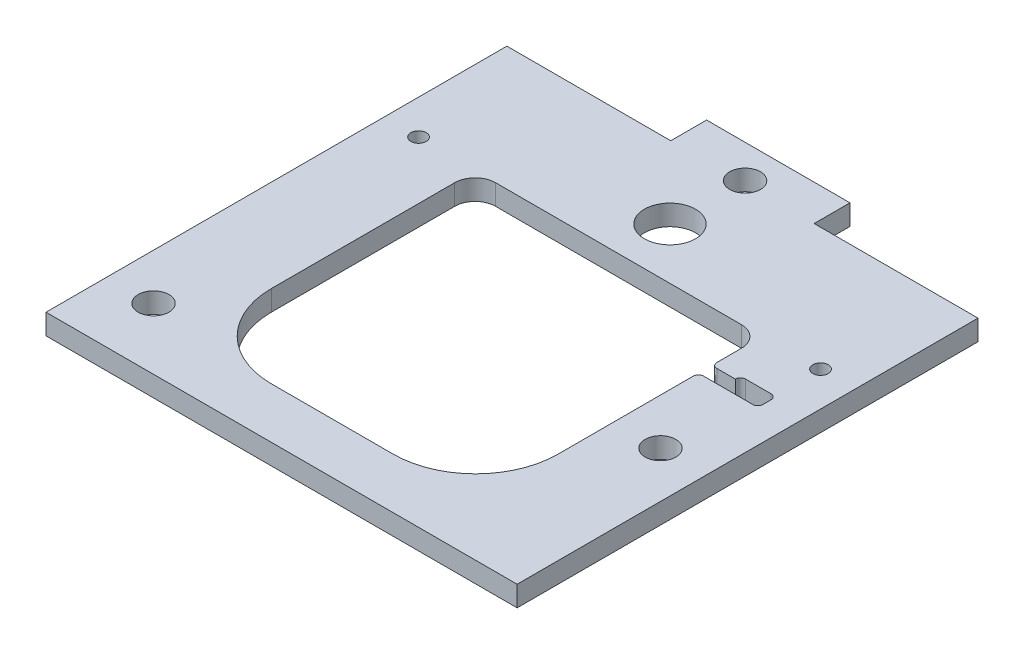
ISO-10303-21;
HEADER;
FILE_DESCRIPTION(('STEP AP214'),'2;1');
FILE_NAME('part.step','',(''),(''),'','','');
FILE_SCHEMA(('AUTOMOTIVE_DESIGN { 1 0 10303 214 1 1 1 1 }'));
ENDSEC;
DATA;
#1=APPLICATION_CONTEXT('core data for automotive mechanical design processes');
#2=APPLICATION_PROTOCOL_DEFINITION('international standard','automotive_design',2000,#1);
#3=PRODUCT_CONTEXT('',#1,'mechanical');
#4=PRODUCT('Part','Part','',(#3));
#5=PRODUCT_RELATED_PRODUCT_CATEGORY('part','',(#4));
#6=PRODUCT_DEFINITION_FORMATION('','',#4);
#7=PRODUCT_DEFINITION_CONTEXT('part definition',#1,'design');
#8=PRODUCT_DEFINITION('design','',#6,#7);
#9=PRODUCT_DEFINITION_SHAPE('','',#8);
#10=(LENGTH_UNIT() NAMED_UNIT(*) SI_UNIT(.MILLI.,.METRE.));
#11=(NAMED_UNIT(*) PLANE_ANGLE_UNIT() SI_UNIT($,.RADIAN.));
#12=(NAMED_UNIT(*) SI_UNIT($,.STERADIAN.) SOLID_ANGLE_UNIT());
#13=UNCERTAINTY_MEASURE_WITH_UNIT(LENGTH_MEASURE(1.E-05),#10,'distance_accuracy_value','');
#14=(GEOMETRIC_REPRESENTATION_CONTEXT(3) GLOBAL_UNCERTAINTY_ASSIGNED_CONTEXT((#13)) GLOBAL_UNIT_ASSIGNED_CONTEXT((#10,
#11,#12)) REPRESENTATION_CONTEXT('',''));
#15=CARTESIAN_POINT('',(0.,0.,0.));
#16=DIRECTION('',(0.,0.,1.));
#17=DIRECTION('',(1.,0.,0.));
#18=AXIS2_PLACEMENT_3D('',#15,#16,#17);
#19=CARTESIAN_POINT('',(14.,0.,-32.9));
#20=DIRECTION('',(1.,0.,0.));
#21=DIRECTION('',(0.,0.,-1.));
#22=AXIS2_PLACEMENT_3D('',#19,#20,#21);
#23=PLANE('',#22);
#24=DIRECTION('',(0.,0.,-1.));
#25=VECTOR('',#24,1.);
#26=CARTESIAN_POINT('',(14.,0.,-32.9));
#27=LINE('',#26,#25);
#28=CARTESIAN_POINT('',(14.,0.,-28.5));
#29=VERTEX_POINT('',#28);
#30=CARTESIAN_POINT('',(14.,0.,-30.9));
#31=VERTEX_POINT('',#30);
#32=EDGE_CURVE('E298',#29,#31,#27,.T.);
#33=ORIENTED_EDGE('',*,*,#32,.F.);
#34=DIRECTION('',(0.,1.,0.));
#35=VECTOR('',#34,1.);
#36=CARTESIAN_POINT('',(14.,0.,-28.5));
#37=LINE('',#36,#35);
#38=CARTESIAN_POINT('',(14.,2.,-28.5));
#39=VERTEX_POINT('',#38);
#40=EDGE_CURVE('E458',#29,#39,#37,.T.);
#41=ORIENTED_EDGE('',*,*,#40,.T.);
#42=DIRECTION('',(0.,0.,-1.));
#43=VECTOR('',#42,1.);
#44=CARTESIAN_POINT('',(14.,2.,-32.9));
#45=LINE('',#44,#43);
#46=CARTESIAN_POINT('',(14.,2.,-30.9));
#47=VERTEX_POINT('',#46);
#48=EDGE_CURVE('E320',#39,#47,#45,.T.);
#49=ORIENTED_EDGE('',*,*,#48,.T.);
#50=DIRECTION('',(0.,1.,0.));
#51=VECTOR('',#50,1.);
#52=CARTESIAN_POINT('',(14.,0.,-30.9));
#53=LINE('',#52,#51);
#54=EDGE_CURVE('E431',#47,#31,#53,.F.);
#55=ORIENTED_EDGE('',*,*,#54,.T.);
#56=EDGE_LOOP('',(#33,#41,#49,#55));
#57=FACE_BOUND('',#56,.T.);
#58=ADVANCED_FACE('F40',(#57),#23,.F.);
#59=CARTESIAN_POINT('',(23.,2.,-45.));
#60=DIRECTION('',(0.,-1.,0.));
#61=DIRECTION('',(0.,0.,-1.));
#62=AXIS2_PLACEMENT_3D('',#59,#60,#61);
#63=PLANE('',#62);
#64=CARTESIAN_POINT('',(19.625,2.,-33.));
#65=DIRECTION('',(0.,1.,0.));
#66=DIRECTION('',(0.,0.,1.));
#67=AXIS2_PLACEMENT_3D('',#64,#65,#66);
#68=CIRCLE('',#67,0.750000000000009);
#69=CARTESIAN_POINT('',(19.625,2.,-32.25));
#70=VERTEX_POINT('',#69);
#71=EDGE_CURVE('E256',#70,#70,#68,.T.);
#72=ORIENTED_EDGE('',*,*,#71,.F.);
#73=EDGE_LOOP('',(#72));
#74=FACE_BOUND('',#73,.T.);
#75=CARTESIAN_POINT('',(-19.625,2.,-33.));
#76=DIRECTION('',(0.,1.,0.));
#77=DIRECTION('',(0.,0.,1.));
#78=AXIS2_PLACEMENT_3D('',#75,#76,#77);
#79=CIRCLE('',#78,0.750000000000002);
#80=CARTESIAN_POINT('',(-19.625,2.,-32.25));
#81=VERTEX_POINT('',#80);
#82=EDGE_CURVE('E262',#81,#81,#79,.T.);
#83=ORIENTED_EDGE('',*,*,#82,.F.);
#84=EDGE_LOOP('',(#83));
#85=FACE_BOUND('',#84,.T.);
#86=CARTESIAN_POINT('',(0.,2.,-37.925));
#87=DIRECTION('',(0.,1.,0.));
#88=DIRECTION('',(0.,0.,1.));
#89=AXIS2_PLACEMENT_3D('',#86,#87,#88);
#90=CIRCLE('',#89,2.5);
#91=CARTESIAN_POINT('',(0.,2.,-35.425));
#92=VERTEX_POINT('',#91);
#93=EDGE_CURVE('E268',#92,#92,#90,.T.);
#94=ORIENTED_EDGE('',*,*,#93,.F.);
#95=EDGE_LOOP('',(#94));
#96=FACE_BOUND('',#95,.T.);
#97=CARTESIAN_POINT('',(0.,2.,-45.2578584115709));
#98=DIRECTION('',(0.,1.,0.));
#99=DIRECTION('',(0.,0.,1.));
#100=AXIS2_PLACEMENT_3D('',#97,#98,#99);
#101=CIRCLE('',#100,1.5);
#102=CARTESIAN_POINT('',(0.,2.,-43.7578584115709));
#103=VERTEX_POINT('',#102);
#104=EDGE_CURVE('E274',#103,#103,#101,.T.);
#105=ORIENTED_EDGE('',*,*,#104,.F.);
#106=EDGE_LOOP('',(#105));
#107=FACE_BOUND('',#106,.T.);
#108=ORIENTED_EDGE('',*,*,#48,.F.);
#109=CARTESIAN_POINT('',(14.5,2.,-28.5));
#110=DIRECTION('',(0.,-1.,0.));
#111=DIRECTION('',(0.,0.,-1.));
#112=AXIS2_PLACEMENT_3D('',#109,#110,#111);
#113=CIRCLE('',#112,0.5);
#114=CARTESIAN_POINT('',(14.5,2.,-28.));
#115=VERTEX_POINT('',#114);
#116=EDGE_CURVE('E463',#39,#115,#113,.F.);
#117=ORIENTED_EDGE('',*,*,#116,.T.);
#118=DIRECTION('',(-1.,0.,0.));
#119=VECTOR('',#118,1.);
#120=CARTESIAN_POINT('',(16.3,2.,-28.));
#121=LINE('',#120,#119);
#122=CARTESIAN_POINT('',(16.3,2.,-28.));
#123=VERTEX_POINT('',#122);
#124=EDGE_CURVE('E247',#123,#115,#121,.T.);
#125=ORIENTED_EDGE('',*,*,#124,.F.);
#126=CARTESIAN_POINT('',(16.8,2.,-28.));
#127=DIRECTION('',(0.,-1.,0.));
#128=DIRECTION('',(0.,0.,-1.));
#129=AXIS2_PLACEMENT_3D('',#126,#127,#128);
#130=CIRCLE('',#129,0.5);
#131=CARTESIAN_POINT('',(16.8,2.,-28.5));
#132=VERTEX_POINT('',#131);
#133=EDGE_CURVE('E237',#123,#132,#130,.T.);
#134=ORIENTED_EDGE('',*,*,#133,.T.);
#135=DIRECTION('',(-1.,0.,0.));
#136=VECTOR('',#135,1.);
#137=CARTESIAN_POINT('',(19.8,2.,-28.5));
#138=LINE('',#137,#136);
#139=CARTESIAN_POINT('',(19.3,2.,-28.5));
#140=VERTEX_POINT('',#139);
#141=EDGE_CURVE('E252',#140,#132,#138,.T.);
#142=ORIENTED_EDGE('',*,*,#141,.F.);
#143=CARTESIAN_POINT('',(19.3,2.,-28.));
#144=DIRECTION('',(0.,-1.,0.));
#145=DIRECTION('',(0.,0.,-1.));
#146=AXIS2_PLACEMENT_3D('',#143,#144,#145);
#147=CIRCLE('',#146,0.5);
#148=CARTESIAN_POINT('',(19.8,2.,-28.));
#149=VERTEX_POINT('',#148);
#150=EDGE_CURVE('E236',#140,#149,#147,.T.);
#151=ORIENTED_EDGE('',*,*,#150,.T.);
#152=DIRECTION('',(0.,0.,-1.));
#153=VECTOR('',#152,1.);
#154=CARTESIAN_POINT('',(19.8,2.,-26.7));
#155=LINE('',#154,#153);
#156=CARTESIAN_POINT('',(19.8,2.,-27.2));
#157=VERTEX_POINT('',#156);
#158=EDGE_CURVE('E482',#157,#149,#155,.T.);
#159=ORIENTED_EDGE('',*,*,#158,.F.);
#160=CARTESIAN_POINT('',(19.3,2.,-27.2));
#161=DIRECTION('',(0.,-1.,0.));
#162=DIRECTION('',(0.,0.,-1.));
#163=AXIS2_PLACEMENT_3D('',#160,#161,#162);
#164=CIRCLE('',#163,0.5);
#165=CARTESIAN_POINT('',(19.3,2.,-26.7));
#166=VERTEX_POINT('',#165);
#167=EDGE_CURVE('E48',#157,#166,#164,.T.);
#168=ORIENTED_EDGE('',*,*,#167,.T.);
#169=DIRECTION('',(1.,0.,0.));
#170=VECTOR('',#169,1.);
#171=CARTESIAN_POINT('',(14.,2.,-26.7));
#172=LINE('',#171,#170);
#173=CARTESIAN_POINT('',(14.5,2.,-26.7));
#174=VERTEX_POINT('',#173);
#175=EDGE_CURVE('E243',#174,#166,#172,.T.);
#176=ORIENTED_EDGE('',*,*,#175,.F.);
#177=CARTESIAN_POINT('',(14.5,2.,-26.2));
#178=DIRECTION('',(0.,-1.,0.));
#179=DIRECTION('',(0.,0.,-1.));
#180=AXIS2_PLACEMENT_3D('',#177,#178,#179);
#181=CIRCLE('',#180,0.5);
#182=CARTESIAN_POINT('',(14.,2.,-26.2));
#183=VERTEX_POINT('',#182);
#184=EDGE_CURVE('E461',#174,#183,#181,.F.);
#185=ORIENTED_EDGE('',*,*,#184,.T.);
#186=CARTESIAN_POINT('',(14.,2.,-13.));
#187=VERTEX_POINT('',#186);
#188=EDGE_CURVE('E321',#187,#183,#45,.T.);
#189=ORIENTED_EDGE('',*,*,#188,.F.);
#190=CARTESIAN_POINT('',(5.95,2.,-13.));
#191=DIRECTION('',(0.,1.,0.));
#192=DIRECTION('',(0.,0.,-1.));
#193=AXIS2_PLACEMENT_3D('',#190,#191,#192);
#194=CIRCLE('',#193,8.05);
#195=CARTESIAN_POINT('',(5.95,2.,-4.95));
#196=VERTEX_POINT('',#195);
#197=EDGE_CURVE('E316',#196,#187,#194,.T.);
#198=ORIENTED_EDGE('',*,*,#197,.F.);
#199=DIRECTION('',(1.,0.,0.));
#200=VECTOR('',#199,1.);
#201=CARTESIAN_POINT('',(-5.95,2.,-4.95));
#202=LINE('',#201,#200);
#203=CARTESIAN_POINT('',(-5.95,2.,-4.95));
#204=VERTEX_POINT('',#203);
#205=EDGE_CURVE('E312',#204,#196,#202,.T.);
#206=ORIENTED_EDGE('',*,*,#205,.F.);
#207=CARTESIAN_POINT('',(-5.95,2.,-13.));
#208=DIRECTION('',(0.,1.,0.));
#209=DIRECTION('',(0.,0.,1.));
#210=AXIS2_PLACEMENT_3D('',#207,#208,#209);
#211=CIRCLE('',#210,8.05);
#212=CARTESIAN_POINT('',(-14.,2.,-13.));
#213=VERTEX_POINT('',#212);
#214=EDGE_CURVE('E308',#213,#204,#211,.T.);
#215=ORIENTED_EDGE('',*,*,#214,.F.);
#216=DIRECTION('',(0.,0.,1.));
#217=VECTOR('',#216,1.);
#218=CARTESIAN_POINT('',(-14.,2.,-32.9));
#219=LINE('',#218,#217);
#220=CARTESIAN_POINT('',(-14.,2.,-30.9));
#221=VERTEX_POINT('',#220);
#222=EDGE_CURVE('E278',#221,#213,#219,.T.);
#223=ORIENTED_EDGE('',*,*,#222,.F.);
#224=CARTESIAN_POINT('',(-12.,2.,-30.9));
#225=DIRECTION('',(0.,-1.,0.));
#226=DIRECTION('',(0.,0.,-1.));
#227=AXIS2_PLACEMENT_3D('',#224,#225,#226);
#228=CIRCLE('',#227,2.);
#229=CARTESIAN_POINT('',(-12.,2.,-32.9));
#230=VERTEX_POINT('',#229);
#231=EDGE_CURVE('E434',#221,#230,#228,.T.);
#232=ORIENTED_EDGE('',*,*,#231,.T.);
#233=DIRECTION('',(-1.,0.,0.));
#234=VECTOR('',#233,1.);
#235=CARTESIAN_POINT('',(-14.,2.,-32.9));
#236=LINE('',#235,#234);
#237=CARTESIAN_POINT('',(12.,2.,-32.9));
#238=VERTEX_POINT('',#237);
#239=EDGE_CURVE('E286',#238,#230,#236,.T.);
#240=ORIENTED_EDGE('',*,*,#239,.F.);
#241=CARTESIAN_POINT('',(12.,2.,-30.9));
#242=DIRECTION('',(0.,-1.,0.));
#243=DIRECTION('',(0.,0.,-1.));
#244=AXIS2_PLACEMENT_3D('',#241,#242,#243);
#245=CIRCLE('',#244,2.);
#246=EDGE_CURVE('E438',#238,#47,#245,.T.);
#247=ORIENTED_EDGE('',*,*,#246,.T.);
#248=EDGE_LOOP('',(#108,#117,#125,#134,#142,#151,#159,#168,#176,#185,#189,#198,#206,#215,#223,
#232,#240,#247));
#249=FACE_BOUND('',#248,.T.);
#250=DIRECTION('',(0.,0.,-1.));
#251=VECTOR('',#250,1.);
#252=CARTESIAN_POINT('',(23.,2.,0.));
#253=LINE('',#252,#251);
#254=CARTESIAN_POINT('',(23.,2.,0.));
#255=VERTEX_POINT('',#254);
#256=CARTESIAN_POINT('',(23.,2.,-45.));
#257=VERTEX_POINT('',#256);
#258=EDGE_CURVE('E354',#255,#257,#253,.T.);
#259=ORIENTED_EDGE('',*,*,#258,.T.);
#260=DIRECTION('',(-1.,0.,0.));
#261=VECTOR('',#260,1.);
#262=CARTESIAN_POINT('',(7.,2.,-45.));
#263=LINE('',#262,#261);
#264=CARTESIAN_POINT('',(7.,2.,-45.));
#265=VERTEX_POINT('',#264);
#266=EDGE_CURVE('E358',#257,#265,#263,.T.);
#267=ORIENTED_EDGE('',*,*,#266,.T.);
#268=DIRECTION('',(0.,0.,-1.));
#269=VECTOR('',#268,1.);
#270=CARTESIAN_POINT('',(7.,2.,-45.));
#271=LINE('',#270,#269);
#272=CARTESIAN_POINT('',(7.,2.,-48.5));
#273=VERTEX_POINT('',#272);
#274=EDGE_CURVE('E361',#265,#273,#271,.T.);
#275=ORIENTED_EDGE('',*,*,#274,.T.);
#276=DIRECTION('',(-1.,0.,0.));
#277=VECTOR('',#276,1.);
#278=CARTESIAN_POINT('',(7.,2.,-48.5));
#279=LINE('',#278,#277);
#280=CARTESIAN_POINT('',(-7.,2.,-48.5));
#281=VERTEX_POINT('',#280);
#282=EDGE_CURVE('E363',#273,#281,#279,.T.);
#283=ORIENTED_EDGE('',*,*,#282,.T.);
#284=DIRECTION('',(0.,0.,1.));
#285=VECTOR('',#284,1.);
#286=CARTESIAN_POINT('',(-7.,2.,-48.5));
#287=LINE('',#286,#285);
#288=CARTESIAN_POINT('',(-7.,2.,-45.));
#289=VERTEX_POINT('',#288);
#290=EDGE_CURVE('E366',#281,#289,#287,.T.);
#291=ORIENTED_EDGE('',*,*,#290,.T.);
#292=DIRECTION('',(-1.,0.,0.));
#293=VECTOR('',#292,1.);
#294=CARTESIAN_POINT('',(-23.,2.,-45.));
#295=LINE('',#294,#293);
#296=CARTESIAN_POINT('',(-23.,2.,-45.));
#297=VERTEX_POINT('',#296);
#298=EDGE_CURVE('E369',#289,#297,#295,.T.);
#299=ORIENTED_EDGE('',*,*,#298,.T.);
#300=DIRECTION('',(0.,0.,1.));
#301=VECTOR('',#300,1.);
#302=CARTESIAN_POINT('',(-23.,2.,0.));
#303=LINE('',#302,#301);
#304=CARTESIAN_POINT('',(-23.,2.,0.));
#305=VERTEX_POINT('',#304);
#306=EDGE_CURVE('E372',#297,#305,#303,.T.);
#307=ORIENTED_EDGE('',*,*,#306,.T.);
#308=DIRECTION('',(1.,0.,0.));
#309=VECTOR('',#308,1.);
#310=CARTESIAN_POINT('',(-23.,2.,0.));
#311=LINE('',#310,#309);
#312=EDGE_CURVE('E375',#305,#255,#311,.T.);
#313=ORIENTED_EDGE('',*,*,#312,.T.);
#314=EDGE_LOOP('',(#259,#267,#275,#283,#291,#299,#307,#313));
#315=FACE_BOUND('',#314,.T.);
#316=CARTESIAN_POINT('',(-18.5,2.,-6.));
#317=DIRECTION('',(0.,1.,0.));
#318=DIRECTION('',(0.,0.,1.));
#319=AXIS2_PLACEMENT_3D('',#316,#317,#318);
#320=CIRCLE('',#319,1.5);
#321=CARTESIAN_POINT('',(-18.5,2.,-4.5));
#322=VERTEX_POINT('',#321);
#323=EDGE_CURVE('E346',#322,#322,#320,.T.);
#324=ORIENTED_EDGE('',*,*,#323,.F.);
#325=EDGE_LOOP('',(#324));
#326=FACE_BOUND('',#325,.T.);
#327=CARTESIAN_POINT('',(18.5,2.,-18.5));
#328=DIRECTION('',(0.,1.,0.));
#329=DIRECTION('',(0.,0.,1.));
#330=AXIS2_PLACEMENT_3D('',#327,#328,#329);
#331=CIRCLE('',#330,1.5);
#332=CARTESIAN_POINT('',(18.5,2.,-17.));
#333=VERTEX_POINT('',#332);
#334=EDGE_CURVE('E338',#333,#333,#331,.T.);
#335=ORIENTED_EDGE('',*,*,#334,.F.);
#336=EDGE_LOOP('',(#335));
#337=FACE_BOUND('',#336,.T.);
#338=ADVANCED_FACE('F479',(#74,#85,#96,#107,#249,#315,#326,#337),#63,.F.);
#339=CARTESIAN_POINT('',(23.,0.,-45.));
#340=DIRECTION('',(0.,-1.,0.));
#341=DIRECTION('',(0.,0.,-1.));
#342=AXIS2_PLACEMENT_3D('',#339,#340,#341);
#343=PLANE('',#342);
#344=DIRECTION('',(-1.,0.,0.));
#345=VECTOR('',#344,1.);
#346=CARTESIAN_POINT('',(16.3,0.,-28.));
#347=LINE('',#346,#345);
#348=CARTESIAN_POINT('',(16.3,0.,-28.));
#349=VERTEX_POINT('',#348);
#350=CARTESIAN_POINT('',(14.5,0.,-28.));
#351=VERTEX_POINT('',#350);
#352=EDGE_CURVE('E229',#349,#351,#347,.T.);
#353=ORIENTED_EDGE('',*,*,#352,.T.);
#354=CARTESIAN_POINT('',(14.5,0.,-28.5));
#355=DIRECTION('',(0.,-1.,0.));
#356=DIRECTION('',(0.,0.,-1.));
#357=AXIS2_PLACEMENT_3D('',#354,#355,#356);
#358=CIRCLE('',#357,0.5);
#359=EDGE_CURVE('E468',#351,#29,#358,.T.);
#360=ORIENTED_EDGE('',*,*,#359,.T.);
#361=ORIENTED_EDGE('',*,*,#32,.T.);
#362=CARTESIAN_POINT('',(12.,0.,-30.9));
#363=DIRECTION('',(0.,-1.,0.));
#364=DIRECTION('',(0.,0.,-1.));
#365=AXIS2_PLACEMENT_3D('',#362,#363,#364);
#366=CIRCLE('',#365,2.);
#367=CARTESIAN_POINT('',(12.,0.,-32.9));
#368=VERTEX_POINT('',#367);
#369=EDGE_CURVE('E441',#31,#368,#366,.F.);
#370=ORIENTED_EDGE('',*,*,#369,.T.);
#371=DIRECTION('',(-1.,0.,0.));
#372=VECTOR('',#371,1.);
#373=CARTESIAN_POINT('',(-14.,0.,-32.9));
#374=LINE('',#373,#372);
#375=CARTESIAN_POINT('',(-12.,0.,-32.9));
#376=VERTEX_POINT('',#375);
#377=EDGE_CURVE('E302',#368,#376,#374,.T.);
#378=ORIENTED_EDGE('',*,*,#377,.T.);
#379=CARTESIAN_POINT('',(-12.,0.,-30.9));
#380=DIRECTION('',(0.,-1.,0.));
#381=DIRECTION('',(0.,0.,-1.));
#382=AXIS2_PLACEMENT_3D('',#379,#380,#381);
#383=CIRCLE('',#382,2.);
#384=CARTESIAN_POINT('',(-14.,0.,-30.9));
#385=VERTEX_POINT('',#384);
#386=EDGE_CURVE('E436',#376,#385,#383,.F.);
#387=ORIENTED_EDGE('',*,*,#386,.T.);
#388=DIRECTION('',(0.,0.,1.));
#389=VECTOR('',#388,1.);
#390=CARTESIAN_POINT('',(-14.,0.,-32.9));
#391=LINE('',#390,#389);
#392=CARTESIAN_POINT('',(-14.,0.,-13.));
#393=VERTEX_POINT('',#392);
#394=EDGE_CURVE('E282',#385,#393,#391,.T.);
#395=ORIENTED_EDGE('',*,*,#394,.T.);
#396=CARTESIAN_POINT('',(-5.95,0.,-13.));
#397=DIRECTION('',(0.,1.,0.));
#398=DIRECTION('',(0.,0.,1.));
#399=AXIS2_PLACEMENT_3D('',#396,#397,#398);
#400=CIRCLE('',#399,8.05);
#401=CARTESIAN_POINT('',(-5.95,0.,-4.95));
#402=VERTEX_POINT('',#401);
#403=EDGE_CURVE('E285',#393,#402,#400,.T.);
#404=ORIENTED_EDGE('',*,*,#403,.T.);
#405=DIRECTION('',(1.,0.,0.));
#406=VECTOR('',#405,1.);
#407=CARTESIAN_POINT('',(-5.95,0.,-4.95));
#408=LINE('',#407,#406);
#409=CARTESIAN_POINT('',(5.95,0.,-4.95));
#410=VERTEX_POINT('',#409);
#411=EDGE_CURVE('E290',#402,#410,#408,.T.);
#412=ORIENTED_EDGE('',*,*,#411,.T.);
#413=CARTESIAN_POINT('',(5.95,0.,-13.));
#414=DIRECTION('',(0.,1.,0.));
#415=DIRECTION('',(0.,0.,-1.));
#416=AXIS2_PLACEMENT_3D('',#413,#414,#415);
#417=CIRCLE('',#416,8.05);
#418=CARTESIAN_POINT('',(14.,0.,-13.));
#419=VERTEX_POINT('',#418);
#420=EDGE_CURVE('E294',#410,#419,#417,.T.);
#421=ORIENTED_EDGE('',*,*,#420,.T.);
#422=CARTESIAN_POINT('',(14.,0.,-26.2));
#423=VERTEX_POINT('',#422);
#424=EDGE_CURVE('E299',#419,#423,#27,.T.);
#425=ORIENTED_EDGE('',*,*,#424,.T.);
#426=CARTESIAN_POINT('',(14.5,0.,-26.2));
#427=DIRECTION('',(0.,-1.,0.));
#428=DIRECTION('',(0.,0.,-1.));
#429=AXIS2_PLACEMENT_3D('',#426,#427,#428);
#430=CIRCLE('',#429,0.5);
#431=CARTESIAN_POINT('',(14.5,0.,-26.7));
#432=VERTEX_POINT('',#431);
#433=EDGE_CURVE('E466',#423,#432,#430,.T.);
#434=ORIENTED_EDGE('',*,*,#433,.T.);
#435=DIRECTION('',(1.,0.,0.));
#436=VECTOR('',#435,1.);
#437=CARTESIAN_POINT('',(14.,0.,-26.7));
#438=LINE('',#437,#436);
#439=CARTESIAN_POINT('',(19.3,0.,-26.7));
#440=VERTEX_POINT('',#439);
#441=EDGE_CURVE('E246',#432,#440,#438,.T.);
#442=ORIENTED_EDGE('',*,*,#441,.T.);
#443=CARTESIAN_POINT('',(19.3,0.,-27.2));
#444=DIRECTION('',(0.,-1.,0.));
#445=DIRECTION('',(0.,0.,-1.));
#446=AXIS2_PLACEMENT_3D('',#443,#444,#445);
#447=CIRCLE('',#446,0.5);
#448=CARTESIAN_POINT('',(19.8,0.,-27.2));
#449=VERTEX_POINT('',#448);
#450=EDGE_CURVE('E11',#440,#449,#447,.F.);
#451=ORIENTED_EDGE('',*,*,#450,.T.);
#452=DIRECTION('',(0.,0.,-1.));
#453=VECTOR('',#452,1.);
#454=CARTESIAN_POINT('',(19.8,0.,-26.7));
#455=LINE('',#454,#453);
#456=CARTESIAN_POINT('',(19.8,0.,-28.));
#457=VERTEX_POINT('',#456);
#458=EDGE_CURVE('E495',#449,#457,#455,.T.);
#459=ORIENTED_EDGE('',*,*,#458,.T.);
#460=CARTESIAN_POINT('',(19.3,0.,-28.));
#461=DIRECTION('',(0.,-1.,0.));
#462=DIRECTION('',(0.,0.,-1.));
#463=AXIS2_PLACEMENT_3D('',#460,#461,#462);
#464=CIRCLE('',#463,0.5);
#465=CARTESIAN_POINT('',(19.3,0.,-28.5));
#466=VERTEX_POINT('',#465);
#467=EDGE_CURVE('E473',#457,#466,#464,.F.);
#468=ORIENTED_EDGE('',*,*,#467,.T.);
#469=DIRECTION('',(-1.,0.,0.));
#470=VECTOR('',#469,1.);
#471=CARTESIAN_POINT('',(19.8,0.,-28.5));
#472=LINE('',#471,#470);
#473=CARTESIAN_POINT('',(16.8,0.,-28.5));
#474=VERTEX_POINT('',#473);
#475=EDGE_CURVE('E232',#466,#474,#472,.T.);
#476=ORIENTED_EDGE('',*,*,#475,.T.);
#477=CARTESIAN_POINT('',(16.8,0.,-28.));
#478=DIRECTION('',(0.,-1.,0.));
#479=DIRECTION('',(0.,0.,-1.));
#480=AXIS2_PLACEMENT_3D('',#477,#478,#479);
#481=CIRCLE('',#480,0.5);
#482=EDGE_CURVE('E226',#474,#349,#481,.F.);
#483=ORIENTED_EDGE('',*,*,#482,.T.);
#484=EDGE_LOOP('',(#353,#360,#361,#370,#378,#387,#395,#404,#412,#421,#425,#434,#442,#451,#459,
#468,#476,#483));
#485=FACE_BOUND('',#484,.T.);
#486=CARTESIAN_POINT('',(19.625,0.,-33.));
#487=DIRECTION('',(0.,-1.,0.));
#488=DIRECTION('',(0.,0.,-1.));
#489=AXIS2_PLACEMENT_3D('',#486,#487,#488);
#490=CIRCLE('',#489,0.750000000000009);
#491=CARTESIAN_POINT('',(19.625,0.,-33.75));
#492=VERTEX_POINT('',#491);
#493=EDGE_CURVE('E250',#492,#492,#490,.F.);
#494=ORIENTED_EDGE('',*,*,#493,.T.);
#495=EDGE_LOOP('',(#494));
#496=FACE_BOUND('',#495,.T.);
#497=CARTESIAN_POINT('',(-19.625,0.,-33.));
#498=DIRECTION('',(0.,-1.,0.));
#499=DIRECTION('',(0.,0.,-1.));
#500=AXIS2_PLACEMENT_3D('',#497,#498,#499);
#501=CIRCLE('',#500,0.750000000000002);
#502=CARTESIAN_POINT('',(-19.625,0.,-33.75));
#503=VERTEX_POINT('',#502);
#504=EDGE_CURVE('E259',#503,#503,#501,.F.);
#505=ORIENTED_EDGE('',*,*,#504,.T.);
#506=EDGE_LOOP('',(#505));
#507=FACE_BOUND('',#506,.T.);
#508=CARTESIAN_POINT('',(0.,0.,-37.925));
#509=DIRECTION('',(0.,-1.,0.));
#510=DIRECTION('',(0.,0.,-1.));
#511=AXIS2_PLACEMENT_3D('',#508,#509,#510);
#512=CIRCLE('',#511,2.5);
#513=CARTESIAN_POINT('',(0.,0.,-40.425));
#514=VERTEX_POINT('',#513);
#515=EDGE_CURVE('E265',#514,#514,#512,.F.);
#516=ORIENTED_EDGE('',*,*,#515,.T.);
#517=EDGE_LOOP('',(#516));
#518=FACE_BOUND('',#517,.T.);
#519=CARTESIAN_POINT('',(0.,0.,-45.2578584115709));
#520=DIRECTION('',(0.,-1.,0.));
#521=DIRECTION('',(0.,0.,-1.));
#522=AXIS2_PLACEMENT_3D('',#519,#520,#521);
#523=CIRCLE('',#522,1.5);
#524=CARTESIAN_POINT('',(0.,0.,-46.7578584115709));
#525=VERTEX_POINT('',#524);
#526=EDGE_CURVE('E271',#525,#525,#523,.F.);
#527=ORIENTED_EDGE('',*,*,#526,.T.);
#528=EDGE_LOOP('',(#527));
#529=FACE_BOUND('',#528,.T.);
#530=CARTESIAN_POINT('',(-18.5,0.,-6.));
#531=DIRECTION('',(0.,1.,0.));
#532=DIRECTION('',(0.,0.,1.));
#533=AXIS2_PLACEMENT_3D('',#530,#531,#532);
#534=CIRCLE('',#533,1.5);
#535=CARTESIAN_POINT('',(-18.5,0.,-4.5));
#536=VERTEX_POINT('',#535);
#537=EDGE_CURVE('E342',#536,#536,#534,.T.);
#538=ORIENTED_EDGE('',*,*,#537,.T.);
#539=EDGE_LOOP('',(#538));
#540=FACE_BOUND('',#539,.T.);
#541=DIRECTION('',(0.,0.,-1.));
#542=VECTOR('',#541,1.);
#543=CARTESIAN_POINT('',(23.,0.,0.));
#544=LINE('',#543,#542);
#545=CARTESIAN_POINT('',(23.,0.,0.));
#546=VERTEX_POINT('',#545);
#547=CARTESIAN_POINT('',(23.,0.,-45.));
#548=VERTEX_POINT('',#547);
#549=EDGE_CURVE('E350',#546,#548,#544,.T.);
#550=ORIENTED_EDGE('',*,*,#549,.F.);
#551=DIRECTION('',(1.,0.,0.));
#552=VECTOR('',#551,1.);
#553=CARTESIAN_POINT('',(-23.,0.,0.));
#554=LINE('',#553,#552);
#555=CARTESIAN_POINT('',(-23.,0.,0.));
#556=VERTEX_POINT('',#555);
#557=EDGE_CURVE('E359',#556,#546,#554,.T.);
#558=ORIENTED_EDGE('',*,*,#557,.F.);
#559=DIRECTION('',(0.,0.,1.));
#560=VECTOR('',#559,1.);
#561=CARTESIAN_POINT('',(-23.,0.,0.));
#562=LINE('',#561,#560);
#563=CARTESIAN_POINT('',(-23.,0.,-45.));
#564=VERTEX_POINT('',#563);
#565=EDGE_CURVE('E394',#564,#556,#562,.T.);
#566=ORIENTED_EDGE('',*,*,#565,.F.);
#567=DIRECTION('',(-1.,0.,0.));
#568=VECTOR('',#567,1.);
#569=CARTESIAN_POINT('',(-23.,0.,-45.));
#570=LINE('',#569,#568);
#571=CARTESIAN_POINT('',(-7.,0.,-45.));
#572=VERTEX_POINT('',#571);
#573=EDGE_CURVE('E391',#572,#564,#570,.T.);
#574=ORIENTED_EDGE('',*,*,#573,.F.);
#575=DIRECTION('',(0.,0.,1.));
#576=VECTOR('',#575,1.);
#577=CARTESIAN_POINT('',(-7.,0.,-48.5));
#578=LINE('',#577,#576);
#579=CARTESIAN_POINT('',(-7.,0.,-48.5));
#580=VERTEX_POINT('',#579);
#581=EDGE_CURVE('E388',#580,#572,#578,.T.);
#582=ORIENTED_EDGE('',*,*,#581,.F.);
#583=DIRECTION('',(-1.,0.,0.));
#584=VECTOR('',#583,1.);
#585=CARTESIAN_POINT('',(7.,0.,-48.5));
#586=LINE('',#585,#584);
#587=CARTESIAN_POINT('',(7.,0.,-48.5));
#588=VERTEX_POINT('',#587);
#589=EDGE_CURVE('E385',#588,#580,#586,.T.);
#590=ORIENTED_EDGE('',*,*,#589,.F.);
#591=DIRECTION('',(0.,0.,-1.));
#592=VECTOR('',#591,1.);
#593=CARTESIAN_POINT('',(7.,0.,-45.));
#594=LINE('',#593,#592);
#595=CARTESIAN_POINT('',(7.,0.,-45.));
#596=VERTEX_POINT('',#595);
#597=EDGE_CURVE('E383',#596,#588,#594,.T.);
#598=ORIENTED_EDGE('',*,*,#597,.F.);
#599=DIRECTION('',(-1.,0.,0.));
#600=VECTOR('',#599,1.);
#601=CARTESIAN_POINT('',(7.,0.,-45.));
#602=LINE('',#601,#600);
#603=EDGE_CURVE('E381',#548,#596,#602,.T.);
#604=ORIENTED_EDGE('',*,*,#603,.F.);
#605=EDGE_LOOP('',(#550,#558,#566,#574,#582,#590,#598,#604));
#606=FACE_BOUND('',#605,.T.);
#607=CARTESIAN_POINT('',(18.5,0.,-18.5));
#608=DIRECTION('',(0.,1.,0.));
#609=DIRECTION('',(0.,0.,1.));
#610=AXIS2_PLACEMENT_3D('',#607,#608,#609);
#611=CIRCLE('',#610,1.5);
#612=CARTESIAN_POINT('',(18.5,0.,-17.));
#613=VERTEX_POINT('',#612);
#614=EDGE_CURVE('E329',#613,#613,#611,.T.);
#615=ORIENTED_EDGE('',*,*,#614,.T.);
#616=EDGE_LOOP('',(#615));
#617=FACE_BOUND('',#616,.T.);
#618=ADVANCED_FACE('F227',(#485,#496,#507,#518,#529,#540,#606,#617),#343,.T.);
#619=CARTESIAN_POINT('',(23.,2.,0.));
#620=DIRECTION('',(-1.,0.,0.));
#621=DIRECTION('',(0.,0.,1.));
#622=AXIS2_PLACEMENT_3D('',#619,#620,#621);
#623=PLANE('',#622);
#624=ORIENTED_EDGE('',*,*,#549,.T.);
#625=DIRECTION('',(0.,-1.,0.));
#626=VECTOR('',#625,1.);
#627=CARTESIAN_POINT('',(23.,2.,-45.));
#628=LINE('',#627,#626);
#629=EDGE_CURVE('E420',#257,#548,#628,.T.);
#630=ORIENTED_EDGE('',*,*,#629,.F.);
#631=ORIENTED_EDGE('',*,*,#258,.F.);
#632=DIRECTION('',(0.,-1.,0.));
#633=VECTOR('',#632,1.);
#634=CARTESIAN_POINT('',(23.,2.,0.));
#635=LINE('',#634,#633);
#636=EDGE_CURVE('E377',#255,#546,#635,.T.);
#637=ORIENTED_EDGE('',*,*,#636,.T.);
#638=EDGE_LOOP('',(#624,#630,#631,#637));
#639=FACE_BOUND('',#638,.T.);
#640=ADVANCED_FACE('F807',(#639),#623,.F.);
#641=CARTESIAN_POINT('',(7.,2.,-45.));
#642=DIRECTION('',(0.,0.,1.));
#643=DIRECTION('',(1.,0.,0.));
#644=AXIS2_PLACEMENT_3D('',#641,#642,#643);
#645=PLANE('',#644);
#646=ORIENTED_EDGE('',*,*,#603,.T.);
#647=DIRECTION('',(0.,-1.,0.));
#648=VECTOR('',#647,1.);
#649=CARTESIAN_POINT('',(7.,2.,-45.));
#650=LINE('',#649,#648);
#651=EDGE_CURVE('E417',#265,#596,#650,.T.);
#652=ORIENTED_EDGE('',*,*,#651,.F.);
#653=ORIENTED_EDGE('',*,*,#266,.F.);
#654=ORIENTED_EDGE('',*,*,#629,.T.);
#655=EDGE_LOOP('',(#646,#652,#653,#654));
#656=FACE_BOUND('',#655,.T.);
#657=ADVANCED_FACE('F798',(#656),#645,.F.);
#658=CARTESIAN_POINT('',(7.,2.,-45.));
#659=DIRECTION('',(-1.,0.,0.));
#660=DIRECTION('',(0.,0.,1.));
#661=AXIS2_PLACEMENT_3D('',#658,#659,#660);
#662=PLANE('',#661);
#663=ORIENTED_EDGE('',*,*,#597,.T.);
#664=DIRECTION('',(0.,-1.,0.));
#665=VECTOR('',#664,1.);
#666=CARTESIAN_POINT('',(7.,2.,-48.5));
#667=LINE('',#666,#665);
#668=EDGE_CURVE('E414',#273,#588,#667,.T.);
#669=ORIENTED_EDGE('',*,*,#668,.F.);
#670=ORIENTED_EDGE('',*,*,#274,.F.);
#671=ORIENTED_EDGE('',*,*,#651,.T.);
#672=EDGE_LOOP('',(#663,#669,#670,#671));
#673=FACE_BOUND('',#672,.T.);
#674=ADVANCED_FACE('F789',(#673),#662,.F.);
#675=CARTESIAN_POINT('',(7.,2.,-48.5));
#676=DIRECTION('',(0.,0.,1.));
#677=DIRECTION('',(1.,0.,0.));
#678=AXIS2_PLACEMENT_3D('',#675,#676,#677);
#679=PLANE('',#678);
#680=ORIENTED_EDGE('',*,*,#589,.T.);
#681=DIRECTION('',(0.,-1.,0.));
#682=VECTOR('',#681,1.);
#683=CARTESIAN_POINT('',(-7.,2.,-48.5));
#684=LINE('',#683,#682);
#685=EDGE_CURVE('E410',#281,#580,#684,.T.);
#686=ORIENTED_EDGE('',*,*,#685,.F.);
#687=ORIENTED_EDGE('',*,*,#282,.F.);
#688=ORIENTED_EDGE('',*,*,#668,.T.);
#689=EDGE_LOOP('',(#680,#686,#687,#688));
#690=FACE_BOUND('',#689,.T.);
#691=ADVANCED_FACE('F780',(#690),#679,.F.);
#692=CARTESIAN_POINT('',(-7.,2.,-48.5));
#693=DIRECTION('',(1.,0.,0.));
#694=DIRECTION('',(0.,0.,-1.));
#695=AXIS2_PLACEMENT_3D('',#692,#693,#694);
#696=PLANE('',#695);
#697=ORIENTED_EDGE('',*,*,#581,.T.);
#698=DIRECTION('',(0.,-1.,0.));
#699=VECTOR('',#698,1.);
#700=CARTESIAN_POINT('',(-7.,2.,-45.));
#701=LINE('',#700,#699);
#702=EDGE_CURVE('E406',#289,#572,#701,.T.);
#703=ORIENTED_EDGE('',*,*,#702,.F.);
#704=ORIENTED_EDGE('',*,*,#290,.F.);
#705=ORIENTED_EDGE('',*,*,#685,.T.);
#706=EDGE_LOOP('',(#697,#703,#704,#705));
#707=FACE_BOUND('',#706,.T.);
#708=ADVANCED_FACE('F771',(#707),#696,.F.);
#709=CARTESIAN_POINT('',(-23.,2.,-45.));
#710=DIRECTION('',(0.,0.,1.));
#711=DIRECTION('',(1.,0.,0.));
#712=AXIS2_PLACEMENT_3D('',#709,#710,#711);
#713=PLANE('',#712);
#714=ORIENTED_EDGE('',*,*,#573,.T.);
#715=DIRECTION('',(0.,-1.,0.));
#716=VECTOR('',#715,1.);
#717=CARTESIAN_POINT('',(-23.,2.,-45.));
#718=LINE('',#717,#716);
#719=EDGE_CURVE('E403',#297,#564,#718,.T.);
#720=ORIENTED_EDGE('',*,*,#719,.F.);
#721=ORIENTED_EDGE('',*,*,#298,.F.);
#722=ORIENTED_EDGE('',*,*,#702,.T.);
#723=EDGE_LOOP('',(#714,#720,#721,#722));
#724=FACE_BOUND('',#723,.T.);
#725=ADVANCED_FACE('F762',(#724),#713,.F.);
#726=CARTESIAN_POINT('',(-23.,2.,0.));
#727=DIRECTION('',(1.,0.,0.));
#728=DIRECTION('',(0.,0.,-1.));
#729=AXIS2_PLACEMENT_3D('',#726,#727,#728);
#730=PLANE('',#729);
#731=ORIENTED_EDGE('',*,*,#565,.T.);
#732=DIRECTION('',(0.,-1.,0.));
#733=VECTOR('',#732,1.);
#734=CARTESIAN_POINT('',(-23.,2.,0.));
#735=LINE('',#734,#733);
#736=EDGE_CURVE('E400',#305,#556,#735,.T.);
#737=ORIENTED_EDGE('',*,*,#736,.F.);
#738=ORIENTED_EDGE('',*,*,#306,.F.);
#739=ORIENTED_EDGE('',*,*,#719,.T.);
#740=EDGE_LOOP('',(#731,#737,#738,#739));
#741=FACE_BOUND('',#740,.T.);
#742=ADVANCED_FACE('F752',(#741),#730,.F.);
#743=CARTESIAN_POINT('',(-23.,2.,0.));
#744=DIRECTION('',(0.,0.,-1.));
#745=DIRECTION('',(-1.,0.,0.));
#746=AXIS2_PLACEMENT_3D('',#743,#744,#745);
#747=PLANE('',#746);
#748=ORIENTED_EDGE('',*,*,#557,.T.);
#749=ORIENTED_EDGE('',*,*,#636,.F.);
#750=ORIENTED_EDGE('',*,*,#312,.F.);
#751=ORIENTED_EDGE('',*,*,#736,.T.);
#752=EDGE_LOOP('',(#748,#749,#750,#751));
#753=FACE_BOUND('',#752,.T.);
#754=ADVANCED_FACE('F743',(#753),#747,.F.);
#755=CARTESIAN_POINT('',(-18.5,2.,-6.));
#756=DIRECTION('',(0.,-1.,0.));
#757=DIRECTION('',(0.,0.,-1.));
#758=AXIS2_PLACEMENT_3D('',#755,#756,#757);
#759=CYLINDRICAL_SURFACE('',#758,1.5);
#760=ORIENTED_EDGE('',*,*,#323,.T.);
#761=EDGE_LOOP('',(#760));
#762=FACE_BOUND('',#761,.T.);
#763=ORIENTED_EDGE('',*,*,#537,.F.);
#764=EDGE_LOOP('',(#763));
#765=FACE_BOUND('',#764,.T.);
#766=ADVANCED_FACE('F734',(#762,#765),#759,.F.);
#767=CARTESIAN_POINT('',(18.5,2.,-18.5));
#768=DIRECTION('',(0.,-1.,0.));
#769=DIRECTION('',(0.,0.,-1.));
#770=AXIS2_PLACEMENT_3D('',#767,#768,#769);
#771=CYLINDRICAL_SURFACE('',#770,1.5);
#772=ORIENTED_EDGE('',*,*,#334,.T.);
#773=EDGE_LOOP('',(#772));
#774=FACE_BOUND('',#773,.T.);
#775=ORIENTED_EDGE('',*,*,#614,.F.);
#776=EDGE_LOOP('',(#775));
#777=FACE_BOUND('',#776,.T.);
#778=ADVANCED_FACE('F569',(#774,#777),#771,.F.);
#779=CARTESIAN_POINT('',(-14.,0.,-32.9));
#780=DIRECTION('',(-1.,0.,0.));
#781=DIRECTION('',(0.,0.,1.));
#782=AXIS2_PLACEMENT_3D('',#779,#780,#781);
#783=PLANE('',#782);
#784=ORIENTED_EDGE('',*,*,#394,.F.);
#785=DIRECTION('',(0.,1.,0.));
#786=VECTOR('',#785,1.);
#787=CARTESIAN_POINT('',(-14.,2.,-30.9));
#788=LINE('',#787,#786);
#789=EDGE_CURVE('E423',#385,#221,#788,.T.);
#790=ORIENTED_EDGE('',*,*,#789,.T.);
#791=ORIENTED_EDGE('',*,*,#222,.T.);
#792=DIRECTION('',(0.,1.,0.));
#793=VECTOR('',#792,1.);
#794=CARTESIAN_POINT('',(-14.,0.,-13.));
#795=LINE('',#794,#793);
#796=EDGE_CURVE('E305',#393,#213,#795,.T.);
#797=ORIENTED_EDGE('',*,*,#796,.F.);
#798=EDGE_LOOP('',(#784,#790,#791,#797));
#799=FACE_BOUND('',#798,.T.);
#800=ADVANCED_FACE('F530',(#799),#783,.F.);
#801=CARTESIAN_POINT('',(-14.,0.,-32.9));
#802=DIRECTION('',(0.,0.,-1.));
#803=DIRECTION('',(-1.,0.,0.));
#804=AXIS2_PLACEMENT_3D('',#801,#802,#803);
#805=PLANE('',#804);
#806=ORIENTED_EDGE('',*,*,#239,.T.);
#807=DIRECTION('',(0.,1.,0.));
#808=VECTOR('',#807,1.);
#809=CARTESIAN_POINT('',(-12.,0.,-32.9));
#810=LINE('',#809,#808);
#811=EDGE_CURVE('E429',#230,#376,#810,.F.);
#812=ORIENTED_EDGE('',*,*,#811,.T.);
#813=ORIENTED_EDGE('',*,*,#377,.F.);
#814=DIRECTION('',(0.,1.,0.));
#815=VECTOR('',#814,1.);
#816=CARTESIAN_POINT('',(12.,2.,-32.9));
#817=LINE('',#816,#815);
#818=EDGE_CURVE('E426',#368,#238,#817,.T.);
#819=ORIENTED_EDGE('',*,*,#818,.T.);
#820=EDGE_LOOP('',(#806,#812,#813,#819));
#821=FACE_BOUND('',#820,.T.);
#822=ADVANCED_FACE('F521',(#821),#805,.F.);
#823=ORIENTED_EDGE('',*,*,#188,.T.);
#824=DIRECTION('',(0.,1.,0.));
#825=VECTOR('',#824,1.);
#826=CARTESIAN_POINT('',(14.,0.,-26.2));
#827=LINE('',#826,#825);
#828=EDGE_CURVE('E55',#183,#423,#827,.F.);
#829=ORIENTED_EDGE('',*,*,#828,.T.);
#830=ORIENTED_EDGE('',*,*,#424,.F.);
#831=DIRECTION('',(0.,1.,0.));
#832=VECTOR('',#831,1.);
#833=CARTESIAN_POINT('',(14.,0.,-13.));
#834=LINE('',#833,#832);
#835=EDGE_CURVE('E326',#419,#187,#834,.T.);
#836=ORIENTED_EDGE('',*,*,#835,.T.);
#837=EDGE_LOOP('',(#823,#829,#830,#836));
#838=FACE_BOUND('',#837,.T.);
#839=ADVANCED_FACE('F545',(#838),#23,.F.);
#840=CARTESIAN_POINT('',(5.95,0.,-13.));
#841=DIRECTION('',(0.,1.,0.));
#842=DIRECTION('',(0.,0.,1.));
#843=AXIS2_PLACEMENT_3D('',#840,#841,#842);
#844=CYLINDRICAL_SURFACE('',#843,8.05);
#845=ORIENTED_EDGE('',*,*,#197,.T.);
#846=ORIENTED_EDGE('',*,*,#835,.F.);
#847=ORIENTED_EDGE('',*,*,#420,.F.);
#848=DIRECTION('',(0.,1.,0.));
#849=VECTOR('',#848,1.);
#850=CARTESIAN_POINT('',(5.95,0.,-4.95));
#851=LINE('',#850,#849);
#852=EDGE_CURVE('E330',#410,#196,#851,.T.);
#853=ORIENTED_EDGE('',*,*,#852,.T.);
#854=EDGE_LOOP('',(#845,#846,#847,#853));
#855=FACE_BOUND('',#854,.T.);
#856=ADVANCED_FACE('F543',(#855),#844,.F.);
#857=CARTESIAN_POINT('',(-5.95,0.,-4.95));
#858=DIRECTION('',(0.,0.,1.));
#859=DIRECTION('',(1.,0.,0.));
#860=AXIS2_PLACEMENT_3D('',#857,#858,#859);
#861=PLANE('',#860);
#862=ORIENTED_EDGE('',*,*,#205,.T.);
#863=ORIENTED_EDGE('',*,*,#852,.F.);
#864=ORIENTED_EDGE('',*,*,#411,.F.);
#865=DIRECTION('',(0.,1.,0.));
#866=VECTOR('',#865,1.);
#867=CARTESIAN_POINT('',(-5.95,0.,-4.95));
#868=LINE('',#867,#866);
#869=EDGE_CURVE('E332',#402,#204,#868,.T.);
#870=ORIENTED_EDGE('',*,*,#869,.T.);
#871=EDGE_LOOP('',(#862,#863,#864,#870));
#872=FACE_BOUND('',#871,.T.);
#873=ADVANCED_FACE('F539',(#872),#861,.F.);
#874=CARTESIAN_POINT('',(-5.95,0.,-13.));
#875=DIRECTION('',(0.,1.,0.));
#876=DIRECTION('',(0.,0.,1.));
#877=AXIS2_PLACEMENT_3D('',#874,#875,#876);
#878=CYLINDRICAL_SURFACE('',#877,8.05);
#879=ORIENTED_EDGE('',*,*,#214,.T.);
#880=ORIENTED_EDGE('',*,*,#869,.F.);
#881=ORIENTED_EDGE('',*,*,#403,.F.);
#882=ORIENTED_EDGE('',*,*,#796,.T.);
#883=EDGE_LOOP('',(#879,#880,#881,#882));
#884=FACE_BOUND('',#883,.T.);
#885=ADVANCED_FACE('F536',(#884),#878,.F.);
#886=CARTESIAN_POINT('',(-12.,0.,-30.9));
#887=DIRECTION('',(0.,-1.,0.));
#888=DIRECTION('',(0.,0.,-1.));
#889=AXIS2_PLACEMENT_3D('',#886,#887,#888);
#890=CYLINDRICAL_SURFACE('',#889,2.);
#891=ORIENTED_EDGE('',*,*,#386,.F.);
#892=ORIENTED_EDGE('',*,*,#811,.F.);
#893=ORIENTED_EDGE('',*,*,#231,.F.);
#894=ORIENTED_EDGE('',*,*,#789,.F.);
#895=EDGE_LOOP('',(#891,#892,#893,#894));
#896=FACE_BOUND('',#895,.T.);
#897=ADVANCED_FACE('F525',(#896),#890,.F.);
#898=CARTESIAN_POINT('',(12.,0.,-30.9));
#899=DIRECTION('',(0.,-1.,0.));
#900=DIRECTION('',(0.,0.,-1.));
#901=AXIS2_PLACEMENT_3D('',#898,#899,#900);
#902=CYLINDRICAL_SURFACE('',#901,2.);
#903=ORIENTED_EDGE('',*,*,#369,.F.);
#904=ORIENTED_EDGE('',*,*,#54,.F.);
#905=ORIENTED_EDGE('',*,*,#246,.F.);
#906=ORIENTED_EDGE('',*,*,#818,.F.);
#907=EDGE_LOOP('',(#903,#904,#905,#906));
#908=FACE_BOUND('',#907,.T.);
#909=ADVANCED_FACE('F517',(#908),#902,.F.);
#910=CARTESIAN_POINT('',(0.,-0.00100000000000013,-45.2578584115709));
#911=DIRECTION('',(0.,1.,0.));
#912=DIRECTION('',(0.,0.,1.));
#913=AXIS2_PLACEMENT_3D('',#910,#911,#912);
#914=CYLINDRICAL_SURFACE('',#913,1.5);
#915=ORIENTED_EDGE('',*,*,#526,.F.);
#916=EDGE_LOOP('',(#915));
#917=FACE_BOUND('',#916,.T.);
#918=ORIENTED_EDGE('',*,*,#104,.T.);
#919=EDGE_LOOP('',(#918));
#920=FACE_BOUND('',#919,.T.);
#921=ADVANCED_FACE('F572',(#917,#920),#914,.F.);
#922=CARTESIAN_POINT('',(0.,-0.00100000000000013,-37.925));
#923=DIRECTION('',(0.,1.,0.));
#924=DIRECTION('',(0.,0.,1.));
#925=AXIS2_PLACEMENT_3D('',#922,#923,#924);
#926=CYLINDRICAL_SURFACE('',#925,2.5);
#927=ORIENTED_EDGE('',*,*,#515,.F.);
#928=EDGE_LOOP('',(#927));
#929=FACE_BOUND('',#928,.T.);
#930=ORIENTED_EDGE('',*,*,#93,.T.);
#931=EDGE_LOOP('',(#930));
#932=FACE_BOUND('',#931,.T.);
#933=ADVANCED_FACE('F575',(#929,#932),#926,.F.);
#934=CARTESIAN_POINT('',(-19.625,-0.00100000000000013,-33.));
#935=DIRECTION('',(0.,1.,0.));
#936=DIRECTION('',(0.,0.,1.));
#937=AXIS2_PLACEMENT_3D('',#934,#935,#936);
#938=CYLINDRICAL_SURFACE('',#937,0.750000000000002);
#939=ORIENTED_EDGE('',*,*,#504,.F.);
#940=EDGE_LOOP('',(#939));
#941=FACE_BOUND('',#940,.T.);
#942=ORIENTED_EDGE('',*,*,#82,.T.);
#943=EDGE_LOOP('',(#942));
#944=FACE_BOUND('',#943,.T.);
#945=ADVANCED_FACE('F579',(#941,#944),#938,.F.);
#946=CARTESIAN_POINT('',(19.625,-0.00100000000000013,-33.));
#947=DIRECTION('',(0.,1.,0.));
#948=DIRECTION('',(0.,0.,1.));
#949=AXIS2_PLACEMENT_3D('',#946,#947,#948);
#950=CYLINDRICAL_SURFACE('',#949,0.750000000000009);
#951=ORIENTED_EDGE('',*,*,#493,.F.);
#952=EDGE_LOOP('',(#951));
#953=FACE_BOUND('',#952,.T.);
#954=ORIENTED_EDGE('',*,*,#71,.T.);
#955=EDGE_LOOP('',(#954));
#956=FACE_BOUND('',#955,.T.);
#957=ADVANCED_FACE('F583',(#953,#956),#950,.F.);
#958=CARTESIAN_POINT('',(16.3,-0.00100000000000013,-28.));
#959=DIRECTION('',(0.,0.,-1.));
#960=DIRECTION('',(-1.,0.,0.));
#961=AXIS2_PLACEMENT_3D('',#958,#959,#960);
#962=PLANE('',#961);
#963=ORIENTED_EDGE('',*,*,#124,.T.);
#964=DIRECTION('',(0.,1.,0.));
#965=VECTOR('',#964,1.);
#966=CARTESIAN_POINT('',(14.5,-0.00100000000000013,-28.));
#967=LINE('',#966,#965);
#968=EDGE_CURVE('E63',#115,#351,#967,.F.);
#969=ORIENTED_EDGE('',*,*,#968,.T.);
#970=ORIENTED_EDGE('',*,*,#352,.F.);
#971=DIRECTION('',(0.,1.,0.));
#972=VECTOR('',#971,1.);
#973=CARTESIAN_POINT('',(16.3,-0.00100000000000013,-28.));
#974=LINE('',#973,#972);
#975=EDGE_CURVE('E241',#349,#123,#974,.T.);
#976=ORIENTED_EDGE('',*,*,#975,.T.);
#977=EDGE_LOOP('',(#963,#969,#970,#976));
#978=FACE_BOUND('',#977,.T.);
#979=ADVANCED_FACE('F240',(#978),#962,.F.);
#980=CARTESIAN_POINT('',(19.8,-0.00100000000000013,-28.5));
#981=DIRECTION('',(0.,0.,-1.));
#982=DIRECTION('',(-1.,0.,0.));
#983=AXIS2_PLACEMENT_3D('',#980,#981,#982);
#984=PLANE('',#983);
#985=ORIENTED_EDGE('',*,*,#141,.T.);
#986=DIRECTION('',(0.,1.,0.));
#987=VECTOR('',#986,1.);
#988=CARTESIAN_POINT('',(16.8,0.,-28.5));
#989=LINE('',#988,#987);
#990=EDGE_CURVE('E446',#132,#474,#989,.F.);
#991=ORIENTED_EDGE('',*,*,#990,.T.);
#992=ORIENTED_EDGE('',*,*,#475,.F.);
#993=DIRECTION('',(0.,1.,0.));
#994=VECTOR('',#993,1.);
#995=CARTESIAN_POINT('',(19.3,2.,-28.5));
#996=LINE('',#995,#994);
#997=EDGE_CURVE('E443',#466,#140,#996,.T.);
#998=ORIENTED_EDGE('',*,*,#997,.T.);
#999=EDGE_LOOP('',(#985,#991,#992,#998));
#1000=FACE_BOUND('',#999,.T.);
#1001=ADVANCED_FACE('F506',(#1000),#984,.F.);
#1002=CARTESIAN_POINT('',(19.8,-0.00100000000000013,-26.7));
#1003=DIRECTION('',(1.,0.,0.));
#1004=DIRECTION('',(0.,0.,-1.));
#1005=AXIS2_PLACEMENT_3D('',#1002,#1003,#1004);
#1006=PLANE('',#1005);
#1007=ORIENTED_EDGE('',*,*,#158,.T.);
#1008=DIRECTION('',(0.,1.,0.));
#1009=VECTOR('',#1008,1.);
#1010=CARTESIAN_POINT('',(19.8,0.,-28.));
#1011=LINE('',#1010,#1009);
#1012=EDGE_CURVE('E451',#149,#457,#1011,.F.);
#1013=ORIENTED_EDGE('',*,*,#1012,.T.);
#1014=ORIENTED_EDGE('',*,*,#458,.F.);
#1015=DIRECTION('',(0.,1.,0.));
#1016=VECTOR('',#1015,1.);
#1017=CARTESIAN_POINT('',(19.8,2.,-27.2));
#1018=LINE('',#1017,#1016);
#1019=EDGE_CURVE('E448',#449,#157,#1018,.T.);
#1020=ORIENTED_EDGE('',*,*,#1019,.T.);
#1021=EDGE_LOOP('',(#1007,#1013,#1014,#1020));
#1022=FACE_BOUND('',#1021,.T.);
#1023=ADVANCED_FACE('F498',(#1022),#1006,.F.);
#1024=CARTESIAN_POINT('',(14.,-0.00100000000000013,-26.7));
#1025=DIRECTION('',(0.,0.,1.));
#1026=DIRECTION('',(1.,0.,0.));
#1027=AXIS2_PLACEMENT_3D('',#1024,#1025,#1026);
#1028=PLANE('',#1027);
#1029=ORIENTED_EDGE('',*,*,#175,.T.);
#1030=DIRECTION('',(0.,1.,0.));
#1031=VECTOR('',#1030,1.);
#1032=CARTESIAN_POINT('',(19.3,0.,-26.7));
#1033=LINE('',#1032,#1031);
#1034=EDGE_CURVE('E456',#166,#440,#1033,.F.);
#1035=ORIENTED_EDGE('',*,*,#1034,.T.);
#1036=ORIENTED_EDGE('',*,*,#441,.F.);
#1037=DIRECTION('',(0.,1.,0.));
#1038=VECTOR('',#1037,1.);
#1039=CARTESIAN_POINT('',(14.5,-0.00100000000000013,-26.7));
#1040=LINE('',#1039,#1038);
#1041=EDGE_CURVE('E453',#432,#174,#1040,.T.);
#1042=ORIENTED_EDGE('',*,*,#1041,.T.);
#1043=EDGE_LOOP('',(#1029,#1035,#1036,#1042));
#1044=FACE_BOUND('',#1043,.T.);
#1045=ADVANCED_FACE('F487',(#1044),#1028,.F.);
#1046=CARTESIAN_POINT('',(16.8,-0.00100000000000013,-28.));
#1047=DIRECTION('',(0.,-1.,0.));
#1048=DIRECTION('',(0.,0.,-1.));
#1049=AXIS2_PLACEMENT_3D('',#1046,#1047,#1048);
#1050=CYLINDRICAL_SURFACE('',#1049,0.5);
#1051=ORIENTED_EDGE('',*,*,#482,.F.);
#1052=ORIENTED_EDGE('',*,*,#990,.F.);
#1053=ORIENTED_EDGE('',*,*,#133,.F.);
#1054=ORIENTED_EDGE('',*,*,#975,.F.);
#1055=EDGE_LOOP('',(#1051,#1052,#1053,#1054));
#1056=FACE_BOUND('',#1055,.T.);
#1057=ADVANCED_FACE('F245',(#1056),#1050,.F.);
#1058=CARTESIAN_POINT('',(19.3,-0.00100000000000013,-28.));
#1059=DIRECTION('',(0.,-1.,0.));
#1060=DIRECTION('',(0.,0.,-1.));
#1061=AXIS2_PLACEMENT_3D('',#1058,#1059,#1060);
#1062=CYLINDRICAL_SURFACE('',#1061,0.5);
#1063=ORIENTED_EDGE('',*,*,#467,.F.);
#1064=ORIENTED_EDGE('',*,*,#1012,.F.);
#1065=ORIENTED_EDGE('',*,*,#150,.F.);
#1066=ORIENTED_EDGE('',*,*,#997,.F.);
#1067=EDGE_LOOP('',(#1063,#1064,#1065,#1066));
#1068=FACE_BOUND('',#1067,.T.);
#1069=ADVANCED_FACE('F617',(#1068),#1062,.F.);
#1070=CARTESIAN_POINT('',(19.3,-0.00100000000000013,-27.2));
#1071=DIRECTION('',(0.,-1.,0.));
#1072=DIRECTION('',(0.,0.,-1.));
#1073=AXIS2_PLACEMENT_3D('',#1070,#1071,#1072);
#1074=CYLINDRICAL_SURFACE('',#1073,0.5);
#1075=ORIENTED_EDGE('',*,*,#450,.F.);
#1076=ORIENTED_EDGE('',*,*,#1034,.F.);
#1077=ORIENTED_EDGE('',*,*,#167,.F.);
#1078=ORIENTED_EDGE('',*,*,#1019,.F.);
#1079=EDGE_LOOP('',(#1075,#1076,#1077,#1078));
#1080=FACE_BOUND('',#1079,.T.);
#1081=ADVANCED_FACE('F492',(#1080),#1074,.F.);
#1082=CARTESIAN_POINT('',(14.5,0.,-28.5));
#1083=DIRECTION('',(0.,1.,0.));
#1084=DIRECTION('',(0.,0.,1.));
#1085=AXIS2_PLACEMENT_3D('',#1082,#1083,#1084);
#1086=CYLINDRICAL_SURFACE('',#1085,0.5);
#1087=ORIENTED_EDGE('',*,*,#359,.F.);
#1088=ORIENTED_EDGE('',*,*,#968,.F.);
#1089=ORIENTED_EDGE('',*,*,#116,.F.);
#1090=ORIENTED_EDGE('',*,*,#40,.F.);
#1091=EDGE_LOOP('',(#1087,#1088,#1089,#1090));
#1092=FACE_BOUND('',#1091,.T.);
#1093=ADVANCED_FACE('F509',(#1092),#1086,.T.);
#1094=CARTESIAN_POINT('',(14.5,-0.00100000000000013,-26.2));
#1095=DIRECTION('',(0.,1.,0.));
#1096=DIRECTION('',(0.,0.,1.));
#1097=AXIS2_PLACEMENT_3D('',#1094,#1095,#1096);
#1098=CYLINDRICAL_SURFACE('',#1097,0.5);
#1099=ORIENTED_EDGE('',*,*,#433,.F.);
#1100=ORIENTED_EDGE('',*,*,#828,.F.);
#1101=ORIENTED_EDGE('',*,*,#184,.F.);
#1102=ORIENTED_EDGE('',*,*,#1041,.F.);
#1103=EDGE_LOOP('',(#1099,#1100,#1101,#1102));
#1104=FACE_BOUND('',#1103,.T.);
#1105=ADVANCED_FACE('F42',(#1104),#1098,.T.);
#1106=CLOSED_SHELL('',(#58,#338,#618,#640,#657,#674,#691,#708,#725,#742,#754,#766,#778,#800,
#822,#839,#856,#873,#885,#897,#909,#921,#933,#945,#957,#979,#1001,#1023,#1045,#1057,#1069,#1081,
#1093,#1105));
#1107=MANIFOLD_SOLID_BREP('B2',#1106);
#1108=ADVANCED_BREP_SHAPE_REPRESENTATION('',(#18,#1107),#14);
#1109=SHAPE_DEFINITION_REPRESENTATION(#9,#1108);
ENDSEC;
END-ISO-10303-21;
